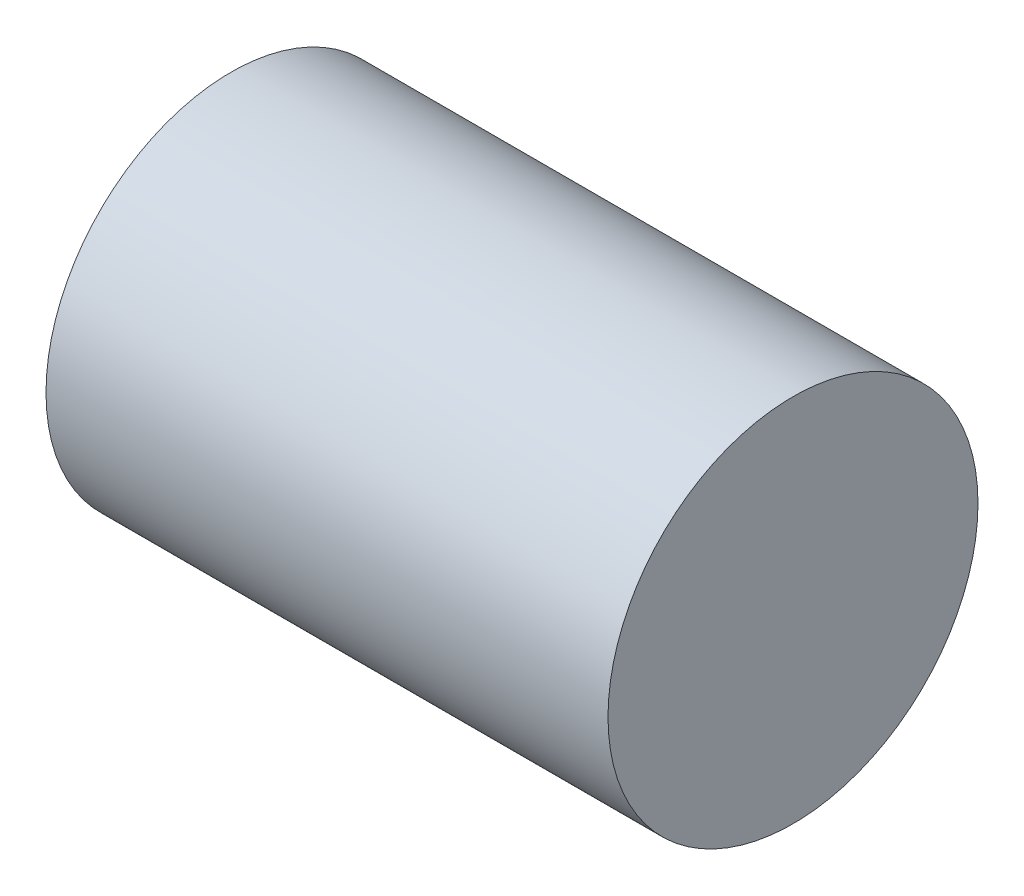
ISO-10303-21;
HEADER;
FILE_DESCRIPTION(('STEP AP214'),'2;1');
FILE_NAME('part.step','',(''),(''),'','','');
FILE_SCHEMA(('AUTOMOTIVE_DESIGN { 1 0 10303 214 1 1 1 1 }'));
ENDSEC;
DATA;
#1=APPLICATION_CONTEXT('core data for automotive mechanical design processes');
#2=APPLICATION_PROTOCOL_DEFINITION('international standard','automotive_design',2000,#1);
#3=PRODUCT_CONTEXT('',#1,'mechanical');
#4=PRODUCT('Part','Part','',(#3));
#5=PRODUCT_RELATED_PRODUCT_CATEGORY('part','',(#4));
#6=PRODUCT_DEFINITION_FORMATION('','',#4);
#7=PRODUCT_DEFINITION_CONTEXT('part definition',#1,'design');
#8=PRODUCT_DEFINITION('design','',#6,#7);
#9=PRODUCT_DEFINITION_SHAPE('','',#8);
#10=(LENGTH_UNIT() NAMED_UNIT(*) SI_UNIT(.MILLI.,.METRE.));
#11=(NAMED_UNIT(*) PLANE_ANGLE_UNIT() SI_UNIT($,.RADIAN.));
#12=(NAMED_UNIT(*) SI_UNIT($,.STERADIAN.) SOLID_ANGLE_UNIT());
#13=UNCERTAINTY_MEASURE_WITH_UNIT(LENGTH_MEASURE(1.E-05),#10,'distance_accuracy_value','');
#14=(GEOMETRIC_REPRESENTATION_CONTEXT(3) GLOBAL_UNCERTAINTY_ASSIGNED_CONTEXT((#13)) GLOBAL_UNIT_ASSIGNED_CONTEXT((#10,
#11,#12)) REPRESENTATION_CONTEXT('',''));
#15=CARTESIAN_POINT('',(0.,0.,0.));
#16=DIRECTION('',(0.,0.,1.));
#17=DIRECTION('',(1.,0.,0.));
#18=AXIS2_PLACEMENT_3D('',#15,#16,#17);
#19=CARTESIAN_POINT('',(-35.687,0.,0.));
#20=DIRECTION('',(1.,0.,0.));
#21=DIRECTION('',(0.,0.,-1.));
#22=AXIS2_PLACEMENT_3D('',#19,#20,#21);
#23=PLANE('',#22);
#24=CARTESIAN_POINT('',(-35.687,0.,0.));
#25=DIRECTION('',(-1.,0.,0.));
#26=DIRECTION('',(0.,0.,1.));
#27=AXIS2_PLACEMENT_3D('',#24,#25,#26);
#28=CIRCLE('',#27,23.495);
#29=CARTESIAN_POINT('',(-35.687,0.,23.495));
#30=VERTEX_POINT('',#29);
#31=EDGE_CURVE('E10',#30,#30,#28,.T.);
#32=ORIENTED_EDGE('',*,*,#31,.T.);
#33=EDGE_LOOP('',(#32));
#34=FACE_BOUND('',#33,.T.);
#35=ADVANCED_FACE('F31',(#34),#23,.F.);
#36=CARTESIAN_POINT('',(-74.3172577319588,0.,0.));
#37=DIRECTION('',(-1.,0.,0.));
#38=DIRECTION('',(0.,0.,1.));
#39=AXIS2_PLACEMENT_3D('',#36,#37,#38);
#40=CYLINDRICAL_SURFACE('',#39,23.495);
#41=ORIENTED_EDGE('',*,*,#31,.F.);
#42=EDGE_LOOP('',(#41));
#43=FACE_BOUND('',#42,.T.);
#44=CARTESIAN_POINT('',(35.687,0.,0.));
#45=DIRECTION('',(-1.,0.,0.));
#46=DIRECTION('',(0.,0.,1.));
#47=AXIS2_PLACEMENT_3D('',#44,#45,#46);
#48=CIRCLE('',#47,23.495);
#49=CARTESIAN_POINT('',(35.687,0.,23.495));
#50=VERTEX_POINT('',#49);
#51=EDGE_CURVE('E37',#50,#50,#48,.T.);
#52=ORIENTED_EDGE('',*,*,#51,.T.);
#53=EDGE_LOOP('',(#52));
#54=FACE_BOUND('',#53,.T.);
#55=ADVANCED_FACE('F43',(#43,#54),#40,.T.);
#56=CARTESIAN_POINT('',(35.687,0.,-23.495));
#57=DIRECTION('',(-1.,0.,0.));
#58=DIRECTION('',(0.,0.,1.));
#59=AXIS2_PLACEMENT_3D('',#56,#57,#58);
#60=PLANE('',#59);
#61=ORIENTED_EDGE('',*,*,#51,.F.);
#62=EDGE_LOOP('',(#61));
#63=FACE_BOUND('',#62,.T.);
#64=ADVANCED_FACE('F45',(#63),#60,.F.);
#65=CLOSED_SHELL('',(#35,#55,#64));
#66=MANIFOLD_SOLID_BREP('B2',#65);
#67=ADVANCED_BREP_SHAPE_REPRESENTATION('',(#18,#66),#14);
#68=SHAPE_DEFINITION_REPRESENTATION(#9,#67);
ENDSEC;
END-ISO-10303-21;
